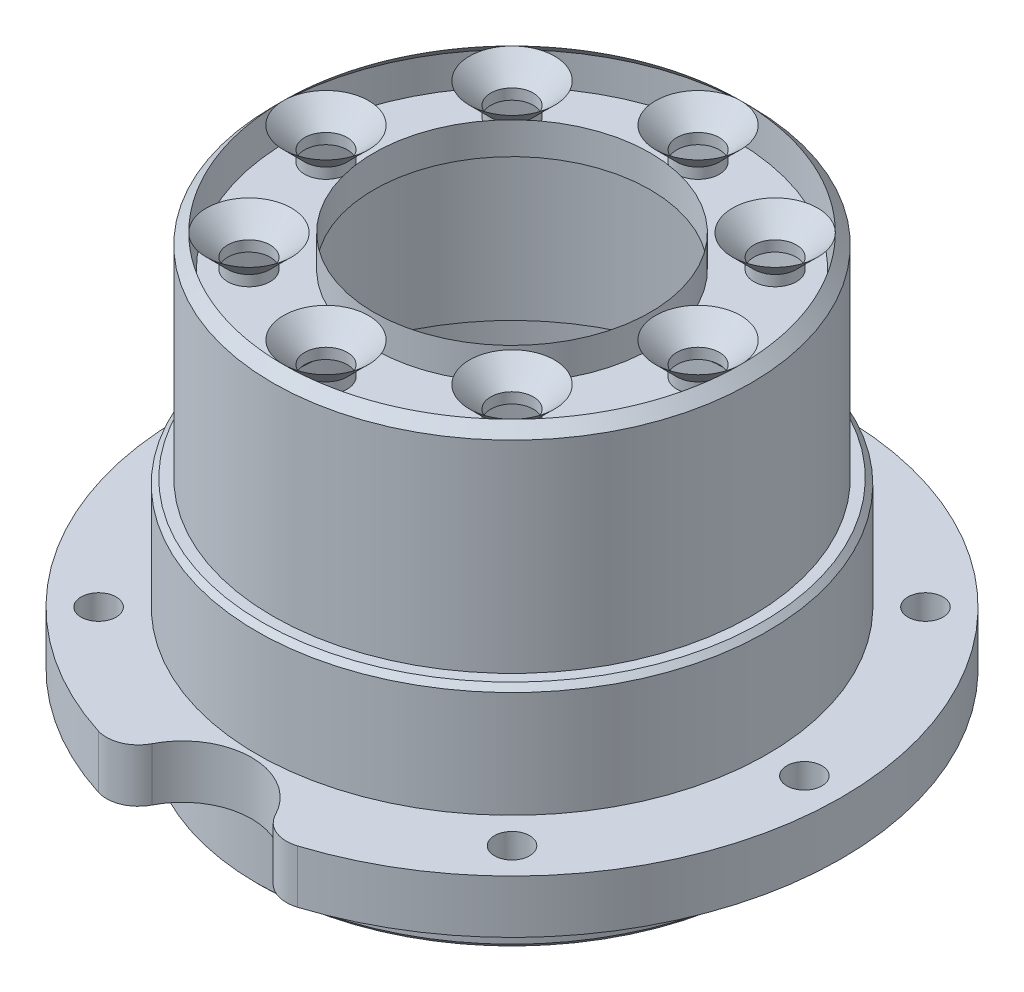
ISO-10303-21;
HEADER;
FILE_DESCRIPTION(('STEP AP214'),'2;1');
FILE_NAME('part.step','',(''),(''),'','','');
FILE_SCHEMA(('AUTOMOTIVE_DESIGN { 1 0 10303 214 1 1 1 1 }'));
ENDSEC;
DATA;
#1=APPLICATION_CONTEXT('core data for automotive mechanical design processes');
#2=APPLICATION_PROTOCOL_DEFINITION('international standard','automotive_design',2000,#1);
#3=PRODUCT_CONTEXT('',#1,'mechanical');
#4=PRODUCT('Part','Part','',(#3));
#5=PRODUCT_RELATED_PRODUCT_CATEGORY('part','',(#4));
#6=PRODUCT_DEFINITION_FORMATION('','',#4);
#7=PRODUCT_DEFINITION_CONTEXT('part definition',#1,'design');
#8=PRODUCT_DEFINITION('design','',#6,#7);
#9=PRODUCT_DEFINITION_SHAPE('','',#8);
#10=(LENGTH_UNIT() NAMED_UNIT(*) SI_UNIT(.MILLI.,.METRE.));
#11=(NAMED_UNIT(*) PLANE_ANGLE_UNIT() SI_UNIT($,.RADIAN.));
#12=(NAMED_UNIT(*) SI_UNIT($,.STERADIAN.) SOLID_ANGLE_UNIT());
#13=UNCERTAINTY_MEASURE_WITH_UNIT(LENGTH_MEASURE(1.E-05),#10,'distance_accuracy_value','');
#14=(GEOMETRIC_REPRESENTATION_CONTEXT(3) GLOBAL_UNCERTAINTY_ASSIGNED_CONTEXT((#13)) GLOBAL_UNIT_ASSIGNED_CONTEXT((#10,
#11,#12)) REPRESENTATION_CONTEXT('',''));
#15=CARTESIAN_POINT('',(0.,0.,0.));
#16=DIRECTION('',(0.,0.,1.));
#17=DIRECTION('',(1.,0.,0.));
#18=AXIS2_PLACEMENT_3D('',#15,#16,#17);
#19=CARTESIAN_POINT('',(0.,0.,0.));
#20=DIRECTION('',(0.,-1.,0.));
#21=DIRECTION('',(0.,0.,-1.));
#22=AXIS2_PLACEMENT_3D('',#19,#20,#21);
#23=CYLINDRICAL_SURFACE('',#22,13.);
#24=CARTESIAN_POINT('',(0.,35.5,0.));
#25=DIRECTION('',(0.,-1.,0.));
#26=DIRECTION('',(0.,0.,-1.));
#27=AXIS2_PLACEMENT_3D('',#24,#25,#26);
#28=CIRCLE('',#27,13.);
#29=CARTESIAN_POINT('',(0.,35.5,-13.));
#30=VERTEX_POINT('',#29);
#31=EDGE_CURVE('E243',#30,#30,#28,.T.);
#32=ORIENTED_EDGE('',*,*,#31,.F.);
#33=EDGE_LOOP('',(#32));
#34=FACE_BOUND('',#33,.T.);
#35=CARTESIAN_POINT('',(0.,32.5,0.));
#36=DIRECTION('',(0.,-1.,0.));
#37=DIRECTION('',(0.,0.,-1.));
#38=AXIS2_PLACEMENT_3D('',#35,#36,#37);
#39=CIRCLE('',#38,13.);
#40=CARTESIAN_POINT('',(0.,32.5,-13.));
#41=VERTEX_POINT('',#40);
#42=EDGE_CURVE('E213',#41,#41,#39,.T.);
#43=ORIENTED_EDGE('',*,*,#42,.T.);
#44=EDGE_LOOP('',(#43));
#45=FACE_BOUND('',#44,.T.);
#46=ADVANCED_FACE('F41',(#34,#45),#23,.F.);
#47=CARTESIAN_POINT('',(-22.5,35.5,0.));
#48=DIRECTION('',(0.,-1.,0.));
#49=DIRECTION('',(0.,0.,-1.));
#50=AXIS2_PLACEMENT_3D('',#47,#48,#49);
#51=PLANE('',#50);
#52=CARTESIAN_POINT('',(0.,35.5,-17.5));
#53=DIRECTION('',(0.,1.,0.));
#54=DIRECTION('',(0.,0.,1.));
#55=AXIS2_PLACEMENT_3D('',#52,#53,#54);
#56=CIRCLE('',#55,4.);
#57=CARTESIAN_POINT('',(0.,35.5,-21.5));
#58=VERTEX_POINT('',#57);
#59=EDGE_CURVE('E111',#58,#58,#56,.T.);
#60=ORIENTED_EDGE('',*,*,#59,.F.);
#61=CARTESIAN_POINT('',(0.,35.5,0.));
#62=DIRECTION('',(0.,-1.,0.));
#63=DIRECTION('',(0.,0.,-1.));
#64=AXIS2_PLACEMENT_3D('',#61,#62,#63);
#65=CIRCLE('',#64,21.5);
#66=CARTESIAN_POINT('',(-15.2027957955108,35.5,-15.2027957955108));
#67=VERTEX_POINT('',#66);
#68=EDGE_CURVE('E293',#58,#67,#65,.F.);
#69=ORIENTED_EDGE('',*,*,#68,.T.);
#70=CARTESIAN_POINT('',(-12.3743686707646,35.5,-12.3743686707646));
#71=DIRECTION('',(0.,1.,0.));
#72=DIRECTION('',(0.,0.,1.));
#73=AXIS2_PLACEMENT_3D('',#70,#71,#72);
#74=CIRCLE('',#73,4.);
#75=EDGE_CURVE('E170',#67,#67,#74,.T.);
#76=ORIENTED_EDGE('',*,*,#75,.F.);
#77=CARTESIAN_POINT('',(0.,35.5,0.));
#78=DIRECTION('',(0.,-1.,0.));
#79=DIRECTION('',(0.,0.,-1.));
#80=AXIS2_PLACEMENT_3D('',#77,#78,#79);
#81=CIRCLE('',#80,21.5);
#82=CARTESIAN_POINT('',(-21.5,35.5,0.));
#83=VERTEX_POINT('',#82);
#84=EDGE_CURVE('E291',#67,#83,#81,.F.);
#85=ORIENTED_EDGE('',*,*,#84,.T.);
#86=CARTESIAN_POINT('',(-17.5,35.5,0.));
#87=DIRECTION('',(0.,1.,0.));
#88=DIRECTION('',(0.,0.,1.));
#89=AXIS2_PLACEMENT_3D('',#86,#87,#88);
#90=CIRCLE('',#89,4.);
#91=EDGE_CURVE('E163',#83,#83,#90,.T.);
#92=ORIENTED_EDGE('',*,*,#91,.F.);
#93=CARTESIAN_POINT('',(0.,35.5,0.));
#94=DIRECTION('',(0.,-1.,0.));
#95=DIRECTION('',(0.,0.,-1.));
#96=AXIS2_PLACEMENT_3D('',#93,#94,#95);
#97=CIRCLE('',#96,21.5);
#98=CARTESIAN_POINT('',(-15.2027957955108,35.5,15.2027957955108));
#99=VERTEX_POINT('',#98);
#100=EDGE_CURVE('E289',#83,#99,#97,.F.);
#101=ORIENTED_EDGE('',*,*,#100,.T.);
#102=CARTESIAN_POINT('',(-12.3743686707646,35.5,12.3743686707646));
#103=DIRECTION('',(0.,1.,0.));
#104=DIRECTION('',(0.,0.,1.));
#105=AXIS2_PLACEMENT_3D('',#102,#103,#104);
#106=CIRCLE('',#105,4.);
#107=EDGE_CURVE('E156',#99,#99,#106,.T.);
#108=ORIENTED_EDGE('',*,*,#107,.F.);
#109=CARTESIAN_POINT('',(0.,35.5,0.));
#110=DIRECTION('',(0.,-1.,0.));
#111=DIRECTION('',(0.,0.,-1.));
#112=AXIS2_PLACEMENT_3D('',#109,#110,#111);
#113=CIRCLE('',#112,21.5);
#114=CARTESIAN_POINT('',(0.,35.5,21.5));
#115=VERTEX_POINT('',#114);
#116=EDGE_CURVE('E287',#99,#115,#113,.F.);
#117=ORIENTED_EDGE('',*,*,#116,.T.);
#118=CARTESIAN_POINT('',(0.,35.5,17.5));
#119=DIRECTION('',(0.,1.,0.));
#120=DIRECTION('',(0.,0.,1.));
#121=AXIS2_PLACEMENT_3D('',#118,#119,#120);
#122=CIRCLE('',#121,4.);
#123=EDGE_CURVE('E149',#115,#115,#122,.T.);
#124=ORIENTED_EDGE('',*,*,#123,.F.);
#125=CARTESIAN_POINT('',(0.,35.5,0.));
#126=DIRECTION('',(0.,-1.,0.));
#127=DIRECTION('',(0.,0.,-1.));
#128=AXIS2_PLACEMENT_3D('',#125,#126,#127);
#129=CIRCLE('',#128,21.5);
#130=CARTESIAN_POINT('',(15.2027957955108,35.5,15.2027957955108));
#131=VERTEX_POINT('',#130);
#132=EDGE_CURVE('E285',#115,#131,#129,.F.);
#133=ORIENTED_EDGE('',*,*,#132,.T.);
#134=CARTESIAN_POINT('',(12.3743686707646,35.5,12.3743686707646));
#135=DIRECTION('',(0.,1.,0.));
#136=DIRECTION('',(0.,0.,1.));
#137=AXIS2_PLACEMENT_3D('',#134,#135,#136);
#138=CIRCLE('',#137,4.);
#139=EDGE_CURVE('E142',#131,#131,#138,.T.);
#140=ORIENTED_EDGE('',*,*,#139,.F.);
#141=CARTESIAN_POINT('',(0.,35.5,0.));
#142=DIRECTION('',(0.,-1.,0.));
#143=DIRECTION('',(0.,0.,-1.));
#144=AXIS2_PLACEMENT_3D('',#141,#142,#143);
#145=CIRCLE('',#144,21.5);
#146=CARTESIAN_POINT('',(21.5,35.5,0.));
#147=VERTEX_POINT('',#146);
#148=EDGE_CURVE('E283',#131,#147,#145,.F.);
#149=ORIENTED_EDGE('',*,*,#148,.T.);
#150=CARTESIAN_POINT('',(17.5,35.5,0.));
#151=DIRECTION('',(0.,1.,0.));
#152=DIRECTION('',(0.,0.,1.));
#153=AXIS2_PLACEMENT_3D('',#150,#151,#152);
#154=CIRCLE('',#153,4.);
#155=EDGE_CURVE('E135',#147,#147,#154,.T.);
#156=ORIENTED_EDGE('',*,*,#155,.F.);
#157=CARTESIAN_POINT('',(0.,35.5,0.));
#158=DIRECTION('',(0.,-1.,0.));
#159=DIRECTION('',(0.,0.,-1.));
#160=AXIS2_PLACEMENT_3D('',#157,#158,#159);
#161=CIRCLE('',#160,21.5);
#162=CARTESIAN_POINT('',(15.2027957955108,35.5,-15.2027957955108));
#163=VERTEX_POINT('',#162);
#164=EDGE_CURVE('E117',#147,#163,#161,.F.);
#165=ORIENTED_EDGE('',*,*,#164,.T.);
#166=CARTESIAN_POINT('',(12.3743686707646,35.5,-12.3743686707646));
#167=DIRECTION('',(0.,1.,0.));
#168=DIRECTION('',(0.,0.,1.));
#169=AXIS2_PLACEMENT_3D('',#166,#167,#168);
#170=CIRCLE('',#169,4.);
#171=EDGE_CURVE('E114',#163,#163,#170,.T.);
#172=ORIENTED_EDGE('',*,*,#171,.F.);
#173=CARTESIAN_POINT('',(0.,35.5,0.));
#174=DIRECTION('',(0.,-1.,0.));
#175=DIRECTION('',(0.,0.,-1.));
#176=AXIS2_PLACEMENT_3D('',#173,#174,#175);
#177=CIRCLE('',#176,21.5);
#178=EDGE_CURVE('E106',#163,#58,#177,.F.);
#179=ORIENTED_EDGE('',*,*,#178,.T.);
#180=EDGE_LOOP('',(#60,#69,#76,#85,#92,#101,#108,#117,#124,#133,#140,#149,#156,#165,#172,#179));
#181=FACE_BOUND('',#180,.T.);
#182=ORIENTED_EDGE('',*,*,#31,.T.);
#183=EDGE_LOOP('',(#182));
#184=FACE_BOUND('',#183,.T.);
#185=ADVANCED_FACE('F108',(#181,#184),#51,.F.);
#186=CARTESIAN_POINT('',(0.,0.,0.));
#187=DIRECTION('',(0.,-1.,0.));
#188=DIRECTION('',(0.,0.,-1.));
#189=AXIS2_PLACEMENT_3D('',#186,#187,#188);
#190=CYLINDRICAL_SURFACE('',#189,22.5);
#191=CARTESIAN_POINT('',(0.,34.5,0.));
#192=DIRECTION('',(0.,-1.,0.));
#193=DIRECTION('',(0.,0.,-1.));
#194=AXIS2_PLACEMENT_3D('',#191,#192,#193);
#195=CIRCLE('',#194,22.5);
#196=CARTESIAN_POINT('',(0.,34.5,-22.5));
#197=VERTEX_POINT('',#196);
#198=EDGE_CURVE('E118',#197,#197,#195,.T.);
#199=ORIENTED_EDGE('',*,*,#198,.T.);
#200=EDGE_LOOP('',(#199));
#201=FACE_BOUND('',#200,.T.);
#202=CARTESIAN_POINT('',(0.,15.5,0.));
#203=DIRECTION('',(0.,-1.,0.));
#204=DIRECTION('',(0.,0.,-1.));
#205=AXIS2_PLACEMENT_3D('',#202,#203,#204);
#206=CIRCLE('',#205,22.5);
#207=CARTESIAN_POINT('',(0.,15.5,-22.5));
#208=VERTEX_POINT('',#207);
#209=EDGE_CURVE('E240',#208,#208,#206,.T.);
#210=ORIENTED_EDGE('',*,*,#209,.F.);
#211=EDGE_LOOP('',(#210));
#212=FACE_BOUND('',#211,.T.);
#213=ADVANCED_FACE('F340',(#201,#212),#190,.T.);
#214=CARTESIAN_POINT('',(-24.,15.5,0.));
#215=DIRECTION('',(0.,-1.,0.));
#216=DIRECTION('',(0.,0.,-1.));
#217=AXIS2_PLACEMENT_3D('',#214,#215,#216);
#218=PLANE('',#217);
#219=CARTESIAN_POINT('',(0.,15.5,0.));
#220=DIRECTION('',(0.,-1.,0.));
#221=DIRECTION('',(0.,0.,-1.));
#222=AXIS2_PLACEMENT_3D('',#219,#220,#221);
#223=CIRCLE('',#222,23.5);
#224=CARTESIAN_POINT('',(0.,15.5,-23.5));
#225=VERTEX_POINT('',#224);
#226=EDGE_CURVE('E277',#225,#225,#223,.F.);
#227=ORIENTED_EDGE('',*,*,#226,.T.);
#228=EDGE_LOOP('',(#227));
#229=FACE_BOUND('',#228,.T.);
#230=ORIENTED_EDGE('',*,*,#209,.T.);
#231=EDGE_LOOP('',(#230));
#232=FACE_BOUND('',#231,.T.);
#233=ADVANCED_FACE('F371',(#229,#232),#218,.F.);
#234=CARTESIAN_POINT('',(0.,0.,0.));
#235=DIRECTION('',(0.,-1.,0.));
#236=DIRECTION('',(0.,0.,-1.));
#237=AXIS2_PLACEMENT_3D('',#234,#235,#236);
#238=CYLINDRICAL_SURFACE('',#237,24.);
#239=CARTESIAN_POINT('',(0.,15.,0.));
#240=DIRECTION('',(0.,-1.,0.));
#241=DIRECTION('',(0.,0.,-1.));
#242=AXIS2_PLACEMENT_3D('',#239,#240,#241);
#243=CIRCLE('',#242,24.);
#244=CARTESIAN_POINT('',(0.,15.,-24.));
#245=VERTEX_POINT('',#244);
#246=EDGE_CURVE('E274',#245,#245,#243,.T.);
#247=ORIENTED_EDGE('',*,*,#246,.T.);
#248=EDGE_LOOP('',(#247));
#249=FACE_BOUND('',#248,.T.);
#250=CARTESIAN_POINT('',(0.,5.,0.));
#251=DIRECTION('',(0.,-1.,0.));
#252=DIRECTION('',(0.,0.,-1.));
#253=AXIS2_PLACEMENT_3D('',#250,#251,#252);
#254=CIRCLE('',#253,24.);
#255=CARTESIAN_POINT('',(0.,5.,-24.));
#256=VERTEX_POINT('',#255);
#257=EDGE_CURVE('E237',#256,#256,#254,.T.);
#258=ORIENTED_EDGE('',*,*,#257,.F.);
#259=EDGE_LOOP('',(#258));
#260=FACE_BOUND('',#259,.T.);
#261=ADVANCED_FACE('F375',(#249,#260),#238,.T.);
#262=CARTESIAN_POINT('',(-31.,5.,0.));
#263=DIRECTION('',(0.,-1.,0.));
#264=DIRECTION('',(0.,0.,-1.));
#265=AXIS2_PLACEMENT_3D('',#262,#263,#264);
#266=PLANE('',#265);
#267=CARTESIAN_POINT('',(-19.4454364826301,5.,-19.4454364826301));
#268=DIRECTION('',(0.,1.,0.));
#269=DIRECTION('',(0.,0.,1.));
#270=AXIS2_PLACEMENT_3D('',#267,#268,#269);
#271=CIRCLE('',#270,1.64999999999999);
#272=CARTESIAN_POINT('',(-19.4454364826301,5.,-17.7954364826301));
#273=VERTEX_POINT('',#272);
#274=EDGE_CURVE('E177',#273,#273,#271,.T.);
#275=ORIENTED_EDGE('',*,*,#274,.F.);
#276=EDGE_LOOP('',(#275));
#277=FACE_BOUND('',#276,.T.);
#278=CARTESIAN_POINT('',(0.,5.,-27.5));
#279=DIRECTION('',(0.,1.,0.));
#280=DIRECTION('',(0.,0.,1.));
#281=AXIS2_PLACEMENT_3D('',#278,#279,#280);
#282=CIRCLE('',#281,1.64999999999999);
#283=CARTESIAN_POINT('',(0.,5.,-25.85));
#284=VERTEX_POINT('',#283);
#285=EDGE_CURVE('E181',#284,#284,#282,.T.);
#286=ORIENTED_EDGE('',*,*,#285,.F.);
#287=EDGE_LOOP('',(#286));
#288=FACE_BOUND('',#287,.T.);
#289=CARTESIAN_POINT('',(19.4454364826301,5.,-19.4454364826301));
#290=DIRECTION('',(0.,1.,0.));
#291=DIRECTION('',(0.,0.,1.));
#292=AXIS2_PLACEMENT_3D('',#289,#290,#291);
#293=CIRCLE('',#292,1.64999999999999);
#294=CARTESIAN_POINT('',(19.4454364826301,5.,-17.7954364826301));
#295=VERTEX_POINT('',#294);
#296=EDGE_CURVE('E187',#295,#295,#293,.T.);
#297=ORIENTED_EDGE('',*,*,#296,.F.);
#298=EDGE_LOOP('',(#297));
#299=FACE_BOUND('',#298,.T.);
#300=CARTESIAN_POINT('',(27.5,5.,0.));
#301=DIRECTION('',(0.,1.,0.));
#302=DIRECTION('',(0.,0.,1.));
#303=AXIS2_PLACEMENT_3D('',#300,#301,#302);
#304=CIRCLE('',#303,1.64999999999999);
#305=CARTESIAN_POINT('',(27.5,5.,1.64999999999999));
#306=VERTEX_POINT('',#305);
#307=EDGE_CURVE('E191',#306,#306,#304,.T.);
#308=ORIENTED_EDGE('',*,*,#307,.F.);
#309=EDGE_LOOP('',(#308));
#310=FACE_BOUND('',#309,.T.);
#311=CARTESIAN_POINT('',(19.4454364826301,5.,19.4454364826301));
#312=DIRECTION('',(0.,1.,0.));
#313=DIRECTION('',(0.,0.,1.));
#314=AXIS2_PLACEMENT_3D('',#311,#312,#313);
#315=CIRCLE('',#314,1.64999999999999);
#316=CARTESIAN_POINT('',(19.4454364826301,5.,21.09543648263));
#317=VERTEX_POINT('',#316);
#318=EDGE_CURVE('E197',#317,#317,#315,.T.);
#319=ORIENTED_EDGE('',*,*,#318,.F.);
#320=EDGE_LOOP('',(#319));
#321=FACE_BOUND('',#320,.T.);
#322=CARTESIAN_POINT('',(-19.4454364826301,5.,19.4454364826301));
#323=DIRECTION('',(0.,1.,0.));
#324=DIRECTION('',(0.,0.,1.));
#325=AXIS2_PLACEMENT_3D('',#322,#323,#324);
#326=CIRCLE('',#325,1.64999999999999);
#327=CARTESIAN_POINT('',(-19.4454364826301,5.,21.09543648263));
#328=VERTEX_POINT('',#327);
#329=EDGE_CURVE('E203',#328,#328,#326,.T.);
#330=ORIENTED_EDGE('',*,*,#329,.F.);
#331=EDGE_LOOP('',(#330));
#332=FACE_BOUND('',#331,.T.);
#333=CARTESIAN_POINT('',(-27.5,5.,0.));
#334=DIRECTION('',(0.,1.,0.));
#335=DIRECTION('',(0.,0.,1.));
#336=AXIS2_PLACEMENT_3D('',#333,#334,#335);
#337=CIRCLE('',#336,1.64999999999999);
#338=CARTESIAN_POINT('',(-27.5,5.,1.64999999999999));
#339=VERTEX_POINT('',#338);
#340=EDGE_CURVE('E207',#339,#339,#337,.T.);
#341=ORIENTED_EDGE('',*,*,#340,.F.);
#342=EDGE_LOOP('',(#341));
#343=FACE_BOUND('',#342,.T.);
#344=CARTESIAN_POINT('',(0.,5.,31.));
#345=DIRECTION('',(0.,1.,0.));
#346=DIRECTION('',(0.,0.,1.));
#347=AXIS2_PLACEMENT_3D('',#344,#345,#346);
#348=CIRCLE('',#347,6.5);
#349=CARTESIAN_POINT('',(5.79238782325286,5.,28.0507215619694));
#350=VERTEX_POINT('',#349);
#351=CARTESIAN_POINT('',(-5.79238782325285,5.,28.0507215619694));
#352=VERTEX_POINT('',#351);
#353=EDGE_CURVE('E123',#350,#352,#348,.T.);
#354=ORIENTED_EDGE('',*,*,#353,.F.);
#355=CARTESIAN_POINT('',(8.4657975878311,5.,26.6895161290323));
#356=DIRECTION('',(0.,-1.,0.));
#357=DIRECTION('',(0.,0.,-1.));
#358=AXIS2_PLACEMENT_3D('',#355,#356,#357);
#359=CIRCLE('',#358,3.);
#360=CARTESIAN_POINT('',(9.37284732938443,5.,29.5491071428571));
#361=VERTEX_POINT('',#360);
#362=EDGE_CURVE('E11',#350,#361,#359,.F.);
#363=ORIENTED_EDGE('',*,*,#362,.T.);
#364=CARTESIAN_POINT('',(0.,5.,0.));
#365=DIRECTION('',(0.,-1.,0.));
#366=DIRECTION('',(0.,0.,-1.));
#367=AXIS2_PLACEMENT_3D('',#364,#365,#366);
#368=CIRCLE('',#367,31.);
#369=CARTESIAN_POINT('',(-9.37284732938443,5.,29.5491071428571));
#370=VERTEX_POINT('',#369);
#371=EDGE_CURVE('E234',#370,#361,#368,.T.);
#372=ORIENTED_EDGE('',*,*,#371,.F.);
#373=CARTESIAN_POINT('',(-8.4657975878311,5.,26.6895161290323));
#374=DIRECTION('',(0.,-1.,0.));
#375=DIRECTION('',(0.,0.,-1.));
#376=AXIS2_PLACEMENT_3D('',#373,#374,#375);
#377=CIRCLE('',#376,3.);
#378=EDGE_CURVE('E49',#370,#352,#377,.F.);
#379=ORIENTED_EDGE('',*,*,#378,.T.);
#380=EDGE_LOOP('',(#354,#363,#372,#379));
#381=FACE_BOUND('',#380,.T.);
#382=ORIENTED_EDGE('',*,*,#257,.T.);
#383=EDGE_LOOP('',(#382));
#384=FACE_BOUND('',#383,.T.);
#385=ADVANCED_FACE('F321',(#277,#288,#299,#310,#321,#332,#343,#381,#384),#266,.F.);
#386=CARTESIAN_POINT('',(0.,0.,0.));
#387=DIRECTION('',(0.,-1.,0.));
#388=DIRECTION('',(0.,0.,-1.));
#389=AXIS2_PLACEMENT_3D('',#386,#387,#388);
#390=CYLINDRICAL_SURFACE('',#389,31.);
#391=ORIENTED_EDGE('',*,*,#371,.T.);
#392=DIRECTION('',(0.,-1.,0.));
#393=VECTOR('',#392,1.);
#394=CARTESIAN_POINT('',(9.37284732938443,0.,29.5491071428571));
#395=LINE('',#394,#393);
#396=CARTESIAN_POINT('',(9.37284732938443,0.,29.5491071428571));
#397=VERTEX_POINT('',#396);
#398=EDGE_CURVE('E301',#361,#397,#395,.T.);
#399=ORIENTED_EDGE('',*,*,#398,.T.);
#400=CARTESIAN_POINT('',(0.,0.,0.));
#401=DIRECTION('',(0.,-1.,0.));
#402=DIRECTION('',(0.,0.,-1.));
#403=AXIS2_PLACEMENT_3D('',#400,#401,#402);
#404=CIRCLE('',#403,31.);
#405=CARTESIAN_POINT('',(-9.37284732938443,0.,29.5491071428571));
#406=VERTEX_POINT('',#405);
#407=EDGE_CURVE('E231',#406,#397,#404,.T.);
#408=ORIENTED_EDGE('',*,*,#407,.F.);
#409=DIRECTION('',(0.,-1.,0.));
#410=VECTOR('',#409,1.);
#411=CARTESIAN_POINT('',(-9.37284732938443,0.,29.5491071428571));
#412=LINE('',#411,#410);
#413=EDGE_CURVE('E298',#406,#370,#412,.F.);
#414=ORIENTED_EDGE('',*,*,#413,.T.);
#415=EDGE_LOOP('',(#391,#399,#408,#414));
#416=FACE_BOUND('',#415,.T.);
#417=ADVANCED_FACE('F319',(#416),#390,.T.);
#418=CARTESIAN_POINT('',(-31.,0.,0.));
#419=DIRECTION('',(0.,1.,0.));
#420=DIRECTION('',(0.,0.,1.));
#421=AXIS2_PLACEMENT_3D('',#418,#419,#420);
#422=PLANE('',#421);
#423=CARTESIAN_POINT('',(-19.4454364826301,0.,-19.4454364826301));
#424=DIRECTION('',(0.,1.,0.));
#425=DIRECTION('',(0.,0.,1.));
#426=AXIS2_PLACEMENT_3D('',#423,#424,#425);
#427=CIRCLE('',#426,1.64999999999999);
#428=CARTESIAN_POINT('',(-19.4454364826301,0.,-17.7954364826301));
#429=VERTEX_POINT('',#428);
#430=EDGE_CURVE('E180',#429,#429,#427,.T.);
#431=ORIENTED_EDGE('',*,*,#430,.T.);
#432=EDGE_LOOP('',(#431));
#433=FACE_BOUND('',#432,.T.);
#434=CARTESIAN_POINT('',(0.,0.,-27.5));
#435=DIRECTION('',(0.,1.,0.));
#436=DIRECTION('',(0.,0.,1.));
#437=AXIS2_PLACEMENT_3D('',#434,#435,#436);
#438=CIRCLE('',#437,1.64999999999999);
#439=CARTESIAN_POINT('',(0.,0.,-25.85));
#440=VERTEX_POINT('',#439);
#441=EDGE_CURVE('E184',#440,#440,#438,.T.);
#442=ORIENTED_EDGE('',*,*,#441,.T.);
#443=EDGE_LOOP('',(#442));
#444=FACE_BOUND('',#443,.T.);
#445=CARTESIAN_POINT('',(19.4454364826301,0.,-19.4454364826301));
#446=DIRECTION('',(0.,1.,0.));
#447=DIRECTION('',(0.,0.,1.));
#448=AXIS2_PLACEMENT_3D('',#445,#446,#447);
#449=CIRCLE('',#448,1.64999999999999);
#450=CARTESIAN_POINT('',(19.4454364826301,0.,-17.7954364826301));
#451=VERTEX_POINT('',#450);
#452=EDGE_CURVE('E190',#451,#451,#449,.T.);
#453=ORIENTED_EDGE('',*,*,#452,.T.);
#454=EDGE_LOOP('',(#453));
#455=FACE_BOUND('',#454,.T.);
#456=CARTESIAN_POINT('',(27.5,0.,0.));
#457=DIRECTION('',(0.,1.,0.));
#458=DIRECTION('',(0.,0.,1.));
#459=AXIS2_PLACEMENT_3D('',#456,#457,#458);
#460=CIRCLE('',#459,1.64999999999999);
#461=CARTESIAN_POINT('',(27.5,0.,1.64999999999999));
#462=VERTEX_POINT('',#461);
#463=EDGE_CURVE('E194',#462,#462,#460,.T.);
#464=ORIENTED_EDGE('',*,*,#463,.T.);
#465=EDGE_LOOP('',(#464));
#466=FACE_BOUND('',#465,.T.);
#467=CARTESIAN_POINT('',(19.4454364826301,0.,19.4454364826301));
#468=DIRECTION('',(0.,1.,0.));
#469=DIRECTION('',(0.,0.,1.));
#470=AXIS2_PLACEMENT_3D('',#467,#468,#469);
#471=CIRCLE('',#470,1.64999999999999);
#472=CARTESIAN_POINT('',(19.4454364826301,0.,21.09543648263));
#473=VERTEX_POINT('',#472);
#474=EDGE_CURVE('E200',#473,#473,#471,.T.);
#475=ORIENTED_EDGE('',*,*,#474,.T.);
#476=EDGE_LOOP('',(#475));
#477=FACE_BOUND('',#476,.T.);
#478=CARTESIAN_POINT('',(-19.4454364826301,0.,19.4454364826301));
#479=DIRECTION('',(0.,1.,0.));
#480=DIRECTION('',(0.,0.,1.));
#481=AXIS2_PLACEMENT_3D('',#478,#479,#480);
#482=CIRCLE('',#481,1.64999999999999);
#483=CARTESIAN_POINT('',(-19.4454364826301,0.,21.0954364826301));
#484=VERTEX_POINT('',#483);
#485=EDGE_CURVE('E206',#484,#484,#482,.T.);
#486=ORIENTED_EDGE('',*,*,#485,.T.);
#487=EDGE_LOOP('',(#486));
#488=FACE_BOUND('',#487,.T.);
#489=CARTESIAN_POINT('',(-27.5,0.,0.));
#490=DIRECTION('',(0.,1.,0.));
#491=DIRECTION('',(0.,0.,1.));
#492=AXIS2_PLACEMENT_3D('',#489,#490,#491);
#493=CIRCLE('',#492,1.64999999999999);
#494=CARTESIAN_POINT('',(-27.5,0.,1.64999999999999));
#495=VERTEX_POINT('',#494);
#496=EDGE_CURVE('E210',#495,#495,#493,.T.);
#497=ORIENTED_EDGE('',*,*,#496,.T.);
#498=EDGE_LOOP('',(#497));
#499=FACE_BOUND('',#498,.T.);
#500=CARTESIAN_POINT('',(0.,0.,0.));
#501=DIRECTION('',(0.,-1.,0.));
#502=DIRECTION('',(0.,0.,-1.));
#503=AXIS2_PLACEMENT_3D('',#500,#501,#502);
#504=CIRCLE('',#503,24.);
#505=CARTESIAN_POINT('',(0.,0.,-24.));
#506=VERTEX_POINT('',#505);
#507=EDGE_CURVE('E228',#506,#506,#504,.T.);
#508=ORIENTED_EDGE('',*,*,#507,.F.);
#509=EDGE_LOOP('',(#508));
#510=FACE_BOUND('',#509,.T.);
#511=ORIENTED_EDGE('',*,*,#407,.T.);
#512=CARTESIAN_POINT('',(8.4657975878311,0.,26.6895161290323));
#513=DIRECTION('',(0.,1.,0.));
#514=DIRECTION('',(0.,0.,1.));
#515=AXIS2_PLACEMENT_3D('',#512,#513,#514);
#516=CIRCLE('',#515,3.);
#517=CARTESIAN_POINT('',(5.79238782325286,0.,28.0507215619694));
#518=VERTEX_POINT('',#517);
#519=EDGE_CURVE('E306',#397,#518,#516,.F.);
#520=ORIENTED_EDGE('',*,*,#519,.T.);
#521=CARTESIAN_POINT('',(0.,0.,31.));
#522=DIRECTION('',(0.,1.,0.));
#523=DIRECTION('',(0.,0.,1.));
#524=AXIS2_PLACEMENT_3D('',#521,#522,#523);
#525=CIRCLE('',#524,6.5);
#526=CARTESIAN_POINT('',(-5.79238782325285,0.,28.0507215619694));
#527=VERTEX_POINT('',#526);
#528=EDGE_CURVE('E295',#518,#527,#525,.T.);
#529=ORIENTED_EDGE('',*,*,#528,.T.);
#530=CARTESIAN_POINT('',(-8.4657975878311,0.,26.6895161290323));
#531=DIRECTION('',(0.,1.,0.));
#532=DIRECTION('',(0.,0.,1.));
#533=AXIS2_PLACEMENT_3D('',#530,#531,#532);
#534=CIRCLE('',#533,3.);
#535=EDGE_CURVE('E304',#527,#406,#534,.F.);
#536=ORIENTED_EDGE('',*,*,#535,.T.);
#537=EDGE_LOOP('',(#511,#520,#529,#536));
#538=FACE_BOUND('',#537,.T.);
#539=ADVANCED_FACE('F315',(#433,#444,#455,#466,#477,#488,#499,#510,#538),#422,.F.);
#540=CARTESIAN_POINT('',(0.,0.,0.));
#541=DIRECTION('',(0.,-1.,0.));
#542=DIRECTION('',(0.,0.,-1.));
#543=AXIS2_PLACEMENT_3D('',#540,#541,#542);
#544=CYLINDRICAL_SURFACE('',#543,24.);
#545=CARTESIAN_POINT('',(0.,-5.49999999999997,0.));
#546=DIRECTION('',(0.,1.,0.));
#547=DIRECTION('',(0.,0.,1.));
#548=AXIS2_PLACEMENT_3D('',#545,#546,#547);
#549=CIRCLE('',#548,24.);
#550=CARTESIAN_POINT('',(0.,-5.49999999999997,24.));
#551=VERTEX_POINT('',#550);
#552=EDGE_CURVE('E271',#551,#551,#549,.T.);
#553=ORIENTED_EDGE('',*,*,#552,.T.);
#554=EDGE_LOOP('',(#553));
#555=FACE_BOUND('',#554,.T.);
#556=ORIENTED_EDGE('',*,*,#507,.T.);
#557=EDGE_LOOP('',(#556));
#558=FACE_BOUND('',#557,.T.);
#559=ADVANCED_FACE('F391',(#555,#558),#544,.T.);
#560=CARTESIAN_POINT('',(-24.,-6.,0.));
#561=DIRECTION('',(0.,1.,0.));
#562=DIRECTION('',(0.,0.,1.));
#563=AXIS2_PLACEMENT_3D('',#560,#561,#562);
#564=PLANE('',#563);
#565=CARTESIAN_POINT('',(0.,-6.,0.));
#566=DIRECTION('',(0.,1.,0.));
#567=DIRECTION('',(0.,0.,1.));
#568=AXIS2_PLACEMENT_3D('',#565,#566,#567);
#569=CIRCLE('',#568,23.5);
#570=CARTESIAN_POINT('',(0.,-6.,23.5));
#571=VERTEX_POINT('',#570);
#572=EDGE_CURVE('E246',#571,#571,#569,.F.);
#573=ORIENTED_EDGE('',*,*,#572,.T.);
#574=EDGE_LOOP('',(#573));
#575=FACE_BOUND('',#574,.T.);
#576=CARTESIAN_POINT('',(0.,-6.,0.));
#577=DIRECTION('',(0.,-1.,0.));
#578=DIRECTION('',(0.,0.,-1.));
#579=AXIS2_PLACEMENT_3D('',#576,#577,#578);
#580=CIRCLE('',#579,22.);
#581=CARTESIAN_POINT('',(0.,-6.,-22.));
#582=VERTEX_POINT('',#581);
#583=EDGE_CURVE('E225',#582,#582,#580,.T.);
#584=ORIENTED_EDGE('',*,*,#583,.F.);
#585=EDGE_LOOP('',(#584));
#586=FACE_BOUND('',#585,.T.);
#587=ADVANCED_FACE('F395',(#575,#586),#564,.F.);
#588=CARTESIAN_POINT('',(0.,0.,0.));
#589=DIRECTION('',(0.,-1.,0.));
#590=DIRECTION('',(0.,0.,-1.));
#591=AXIS2_PLACEMENT_3D('',#588,#589,#590);
#592=CYLINDRICAL_SURFACE('',#591,22.);
#593=CARTESIAN_POINT('',(0.,13.5,0.));
#594=DIRECTION('',(0.,-1.,0.));
#595=DIRECTION('',(0.,0.,-1.));
#596=AXIS2_PLACEMENT_3D('',#593,#594,#595);
#597=CIRCLE('',#596,22.);
#598=CARTESIAN_POINT('',(0.,13.5,-22.));
#599=VERTEX_POINT('',#598);
#600=EDGE_CURVE('E222',#599,#599,#597,.T.);
#601=ORIENTED_EDGE('',*,*,#600,.F.);
#602=EDGE_LOOP('',(#601));
#603=FACE_BOUND('',#602,.T.);
#604=ORIENTED_EDGE('',*,*,#583,.T.);
#605=EDGE_LOOP('',(#604));
#606=FACE_BOUND('',#605,.T.);
#607=ADVANCED_FACE('F399',(#603,#606),#592,.F.);
#608=CARTESIAN_POINT('',(-22.,13.5,0.));
#609=DIRECTION('',(0.,1.,0.));
#610=DIRECTION('',(0.,0.,1.));
#611=AXIS2_PLACEMENT_3D('',#608,#609,#610);
#612=PLANE('',#611);
#613=CARTESIAN_POINT('',(0.,13.5,0.));
#614=DIRECTION('',(0.,-1.,0.));
#615=DIRECTION('',(0.,0.,-1.));
#616=AXIS2_PLACEMENT_3D('',#613,#614,#615);
#617=CIRCLE('',#616,21.);
#618=CARTESIAN_POINT('',(0.,13.5,-21.));
#619=VERTEX_POINT('',#618);
#620=EDGE_CURVE('E219',#619,#619,#617,.T.);
#621=ORIENTED_EDGE('',*,*,#620,.F.);
#622=EDGE_LOOP('',(#621));
#623=FACE_BOUND('',#622,.T.);
#624=ORIENTED_EDGE('',*,*,#600,.T.);
#625=EDGE_LOOP('',(#624));
#626=FACE_BOUND('',#625,.T.);
#627=ADVANCED_FACE('F403',(#623,#626),#612,.F.);
#628=CARTESIAN_POINT('',(0.,0.,0.));
#629=DIRECTION('',(0.,-1.,0.));
#630=DIRECTION('',(0.,0.,-1.));
#631=AXIS2_PLACEMENT_3D('',#628,#629,#630);
#632=CYLINDRICAL_SURFACE('',#631,21.);
#633=CARTESIAN_POINT('',(0.,32.5,0.));
#634=DIRECTION('',(0.,-1.,0.));
#635=DIRECTION('',(0.,0.,-1.));
#636=AXIS2_PLACEMENT_3D('',#633,#634,#635);
#637=CIRCLE('',#636,21.);
#638=CARTESIAN_POINT('',(0.,32.5,-21.));
#639=VERTEX_POINT('',#638);
#640=EDGE_CURVE('E216',#639,#639,#637,.T.);
#641=ORIENTED_EDGE('',*,*,#640,.F.);
#642=EDGE_LOOP('',(#641));
#643=FACE_BOUND('',#642,.T.);
#644=ORIENTED_EDGE('',*,*,#620,.T.);
#645=EDGE_LOOP('',(#644));
#646=FACE_BOUND('',#645,.T.);
#647=ADVANCED_FACE('F407',(#643,#646),#632,.F.);
#648=CARTESIAN_POINT('',(-21.,32.5,0.));
#649=DIRECTION('',(0.,1.,0.));
#650=DIRECTION('',(0.,0.,1.));
#651=AXIS2_PLACEMENT_3D('',#648,#649,#650);
#652=PLANE('',#651);
#653=CARTESIAN_POINT('',(0.,32.5,-17.5));
#654=DIRECTION('',(0.,1.,0.));
#655=DIRECTION('',(0.,0.,1.));
#656=AXIS2_PLACEMENT_3D('',#653,#654,#655);
#657=CIRCLE('',#656,2.00000000000001);
#658=CARTESIAN_POINT('',(0.,32.5,-15.5));
#659=VERTEX_POINT('',#658);
#660=EDGE_CURVE('E126',#659,#659,#657,.T.);
#661=ORIENTED_EDGE('',*,*,#660,.T.);
#662=EDGE_LOOP('',(#661));
#663=FACE_BOUND('',#662,.T.);
#664=CARTESIAN_POINT('',(12.3743686707646,32.5,-12.3743686707646));
#665=DIRECTION('',(0.,1.,0.));
#666=DIRECTION('',(0.,0.,1.));
#667=AXIS2_PLACEMENT_3D('',#664,#665,#666);
#668=CIRCLE('',#667,2.00000000000001);
#669=CARTESIAN_POINT('',(12.3743686707646,32.5,-10.3743686707646));
#670=VERTEX_POINT('',#669);
#671=EDGE_CURVE('E134',#670,#670,#668,.T.);
#672=ORIENTED_EDGE('',*,*,#671,.T.);
#673=EDGE_LOOP('',(#672));
#674=FACE_BOUND('',#673,.T.);
#675=CARTESIAN_POINT('',(17.5,32.5,0.));
#676=DIRECTION('',(0.,1.,0.));
#677=DIRECTION('',(0.,0.,1.));
#678=AXIS2_PLACEMENT_3D('',#675,#676,#677);
#679=CIRCLE('',#678,2.00000000000001);
#680=CARTESIAN_POINT('',(17.5,32.5,2.));
#681=VERTEX_POINT('',#680);
#682=EDGE_CURVE('E141',#681,#681,#679,.T.);
#683=ORIENTED_EDGE('',*,*,#682,.T.);
#684=EDGE_LOOP('',(#683));
#685=FACE_BOUND('',#684,.T.);
#686=CARTESIAN_POINT('',(12.3743686707646,32.5,12.3743686707646));
#687=DIRECTION('',(0.,1.,0.));
#688=DIRECTION('',(0.,0.,1.));
#689=AXIS2_PLACEMENT_3D('',#686,#687,#688);
#690=CIRCLE('',#689,2.00000000000001);
#691=CARTESIAN_POINT('',(12.3743686707646,32.5,14.3743686707646));
#692=VERTEX_POINT('',#691);
#693=EDGE_CURVE('E148',#692,#692,#690,.T.);
#694=ORIENTED_EDGE('',*,*,#693,.T.);
#695=EDGE_LOOP('',(#694));
#696=FACE_BOUND('',#695,.T.);
#697=CARTESIAN_POINT('',(0.,32.5,17.5));
#698=DIRECTION('',(0.,1.,0.));
#699=DIRECTION('',(0.,0.,1.));
#700=AXIS2_PLACEMENT_3D('',#697,#698,#699);
#701=CIRCLE('',#700,2.00000000000001);
#702=CARTESIAN_POINT('',(0.,32.5,19.5));
#703=VERTEX_POINT('',#702);
#704=EDGE_CURVE('E155',#703,#703,#701,.T.);
#705=ORIENTED_EDGE('',*,*,#704,.T.);
#706=EDGE_LOOP('',(#705));
#707=FACE_BOUND('',#706,.T.);
#708=CARTESIAN_POINT('',(-12.3743686707646,32.5,12.3743686707646));
#709=DIRECTION('',(0.,1.,0.));
#710=DIRECTION('',(0.,0.,1.));
#711=AXIS2_PLACEMENT_3D('',#708,#709,#710);
#712=CIRCLE('',#711,2.00000000000001);
#713=CARTESIAN_POINT('',(-12.3743686707646,32.5,14.3743686707646));
#714=VERTEX_POINT('',#713);
#715=EDGE_CURVE('E162',#714,#714,#712,.T.);
#716=ORIENTED_EDGE('',*,*,#715,.T.);
#717=EDGE_LOOP('',(#716));
#718=FACE_BOUND('',#717,.T.);
#719=CARTESIAN_POINT('',(-17.5,32.5,0.));
#720=DIRECTION('',(0.,1.,0.));
#721=DIRECTION('',(0.,0.,1.));
#722=AXIS2_PLACEMENT_3D('',#719,#720,#721);
#723=CIRCLE('',#722,2.00000000000001);
#724=CARTESIAN_POINT('',(-17.5,32.5,2.00000000000001));
#725=VERTEX_POINT('',#724);
#726=EDGE_CURVE('E169',#725,#725,#723,.T.);
#727=ORIENTED_EDGE('',*,*,#726,.T.);
#728=EDGE_LOOP('',(#727));
#729=FACE_BOUND('',#728,.T.);
#730=CARTESIAN_POINT('',(-12.3743686707646,32.5,-12.3743686707646));
#731=DIRECTION('',(0.,1.,0.));
#732=DIRECTION('',(0.,0.,1.));
#733=AXIS2_PLACEMENT_3D('',#730,#731,#732);
#734=CIRCLE('',#733,2.00000000000001);
#735=CARTESIAN_POINT('',(-12.3743686707646,32.5,-10.3743686707646));
#736=VERTEX_POINT('',#735);
#737=EDGE_CURVE('E176',#736,#736,#734,.T.);
#738=ORIENTED_EDGE('',*,*,#737,.T.);
#739=EDGE_LOOP('',(#738));
#740=FACE_BOUND('',#739,.T.);
#741=ORIENTED_EDGE('',*,*,#42,.F.);
#742=EDGE_LOOP('',(#741));
#743=FACE_BOUND('',#742,.T.);
#744=ORIENTED_EDGE('',*,*,#640,.T.);
#745=EDGE_LOOP('',(#744));
#746=FACE_BOUND('',#745,.T.);
#747=ADVANCED_FACE('F411',(#663,#674,#685,#696,#707,#718,#729,#740,#743,#746),#652,.F.);
#748=CARTESIAN_POINT('',(-27.5,5.,0.));
#749=DIRECTION('',(0.,1.,0.));
#750=DIRECTION('',(0.,0.,1.));
#751=AXIS2_PLACEMENT_3D('',#748,#749,#750);
#752=CYLINDRICAL_SURFACE('',#751,1.64999999999999);
#753=ORIENTED_EDGE('',*,*,#340,.T.);
#754=EDGE_LOOP('',(#753));
#755=FACE_BOUND('',#754,.T.);
#756=ORIENTED_EDGE('',*,*,#496,.F.);
#757=EDGE_LOOP('',(#756));
#758=FACE_BOUND('',#757,.T.);
#759=ADVANCED_FACE('F415',(#755,#758),#752,.F.);
#760=CARTESIAN_POINT('',(-19.4454364826301,5.,19.4454364826301));
#761=DIRECTION('',(0.,1.,0.));
#762=DIRECTION('',(0.,0.,1.));
#763=AXIS2_PLACEMENT_3D('',#760,#761,#762);
#764=CYLINDRICAL_SURFACE('',#763,1.64999999999999);
#765=ORIENTED_EDGE('',*,*,#329,.T.);
#766=EDGE_LOOP('',(#765));
#767=FACE_BOUND('',#766,.T.);
#768=ORIENTED_EDGE('',*,*,#485,.F.);
#769=EDGE_LOOP('',(#768));
#770=FACE_BOUND('',#769,.T.);
#771=ADVANCED_FACE('F419',(#767,#770),#764,.F.);
#772=CARTESIAN_POINT('',(19.4454364826301,5.,19.4454364826301));
#773=DIRECTION('',(0.,1.,0.));
#774=DIRECTION('',(0.,0.,1.));
#775=AXIS2_PLACEMENT_3D('',#772,#773,#774);
#776=CYLINDRICAL_SURFACE('',#775,1.64999999999999);
#777=ORIENTED_EDGE('',*,*,#318,.T.);
#778=EDGE_LOOP('',(#777));
#779=FACE_BOUND('',#778,.T.);
#780=ORIENTED_EDGE('',*,*,#474,.F.);
#781=EDGE_LOOP('',(#780));
#782=FACE_BOUND('',#781,.T.);
#783=ADVANCED_FACE('F423',(#779,#782),#776,.F.);
#784=CARTESIAN_POINT('',(27.5,5.,0.));
#785=DIRECTION('',(0.,1.,0.));
#786=DIRECTION('',(0.,0.,1.));
#787=AXIS2_PLACEMENT_3D('',#784,#785,#786);
#788=CYLINDRICAL_SURFACE('',#787,1.64999999999999);
#789=ORIENTED_EDGE('',*,*,#307,.T.);
#790=EDGE_LOOP('',(#789));
#791=FACE_BOUND('',#790,.T.);
#792=ORIENTED_EDGE('',*,*,#463,.F.);
#793=EDGE_LOOP('',(#792));
#794=FACE_BOUND('',#793,.T.);
#795=ADVANCED_FACE('F427',(#791,#794),#788,.F.);
#796=CARTESIAN_POINT('',(19.4454364826301,5.,-19.4454364826301));
#797=DIRECTION('',(0.,1.,0.));
#798=DIRECTION('',(0.,0.,1.));
#799=AXIS2_PLACEMENT_3D('',#796,#797,#798);
#800=CYLINDRICAL_SURFACE('',#799,1.64999999999999);
#801=ORIENTED_EDGE('',*,*,#296,.T.);
#802=EDGE_LOOP('',(#801));
#803=FACE_BOUND('',#802,.T.);
#804=ORIENTED_EDGE('',*,*,#452,.F.);
#805=EDGE_LOOP('',(#804));
#806=FACE_BOUND('',#805,.T.);
#807=ADVANCED_FACE('F431',(#803,#806),#800,.F.);
#808=CARTESIAN_POINT('',(0.,5.,-27.5));
#809=DIRECTION('',(0.,1.,0.));
#810=DIRECTION('',(0.,0.,1.));
#811=AXIS2_PLACEMENT_3D('',#808,#809,#810);
#812=CYLINDRICAL_SURFACE('',#811,1.64999999999999);
#813=ORIENTED_EDGE('',*,*,#285,.T.);
#814=EDGE_LOOP('',(#813));
#815=FACE_BOUND('',#814,.T.);
#816=ORIENTED_EDGE('',*,*,#441,.F.);
#817=EDGE_LOOP('',(#816));
#818=FACE_BOUND('',#817,.T.);
#819=ADVANCED_FACE('F435',(#815,#818),#812,.F.);
#820=CARTESIAN_POINT('',(-19.4454364826301,5.,-19.4454364826301));
#821=DIRECTION('',(0.,1.,0.));
#822=DIRECTION('',(0.,0.,1.));
#823=AXIS2_PLACEMENT_3D('',#820,#821,#822);
#824=CYLINDRICAL_SURFACE('',#823,1.64999999999999);
#825=ORIENTED_EDGE('',*,*,#274,.T.);
#826=EDGE_LOOP('',(#825));
#827=FACE_BOUND('',#826,.T.);
#828=ORIENTED_EDGE('',*,*,#430,.F.);
#829=EDGE_LOOP('',(#828));
#830=FACE_BOUND('',#829,.T.);
#831=ADVANCED_FACE('F439',(#827,#830),#824,.F.);
#832=CARTESIAN_POINT('',(-12.3743686707646,35.5,-12.3743686707646));
#833=DIRECTION('',(0.,1.,0.));
#834=DIRECTION('',(0.,0.,1.));
#835=AXIS2_PLACEMENT_3D('',#832,#833,#834);
#836=CYLINDRICAL_SURFACE('',#835,2.00000000000001);
#837=CARTESIAN_POINT('',(-12.3743686707646,33.5,-12.3743686707646));
#838=DIRECTION('',(0.,1.,0.));
#839=DIRECTION('',(0.,0.,1.));
#840=AXIS2_PLACEMENT_3D('',#837,#838,#839);
#841=CIRCLE('',#840,2.00000000000001);
#842=CARTESIAN_POINT('',(-12.3743686707646,33.5,-10.3743686707646));
#843=VERTEX_POINT('',#842);
#844=EDGE_CURVE('E173',#843,#843,#841,.T.);
#845=ORIENTED_EDGE('',*,*,#844,.T.);
#846=EDGE_LOOP('',(#845));
#847=FACE_BOUND('',#846,.T.);
#848=ORIENTED_EDGE('',*,*,#737,.F.);
#849=EDGE_LOOP('',(#848));
#850=FACE_BOUND('',#849,.T.);
#851=ADVANCED_FACE('F443',(#847,#850),#836,.F.);
#852=CARTESIAN_POINT('',(-12.3743686707646,35.5,-12.3743686707646));
#853=DIRECTION('',(0.,1.,0.));
#854=DIRECTION('',(0.,0.,1.));
#855=AXIS2_PLACEMENT_3D('',#852,#853,#854);
#856=CONICAL_SURFACE('',#855,4.,0.785398163397445);
#857=ORIENTED_EDGE('',*,*,#844,.F.);
#858=EDGE_LOOP('',(#857));
#859=FACE_BOUND('',#858,.T.);
#860=ORIENTED_EDGE('',*,*,#75,.T.);
#861=EDGE_LOOP('',(#860));
#862=FACE_BOUND('',#861,.T.);
#863=ADVANCED_FACE('F447',(#859,#862),#856,.F.);
#864=CARTESIAN_POINT('',(-17.5,35.5,0.));
#865=DIRECTION('',(0.,1.,0.));
#866=DIRECTION('',(0.,0.,1.));
#867=AXIS2_PLACEMENT_3D('',#864,#865,#866);
#868=CYLINDRICAL_SURFACE('',#867,2.00000000000001);
#869=CARTESIAN_POINT('',(-17.5,33.5,0.));
#870=DIRECTION('',(0.,1.,0.));
#871=DIRECTION('',(0.,0.,1.));
#872=AXIS2_PLACEMENT_3D('',#869,#870,#871);
#873=CIRCLE('',#872,2.00000000000001);
#874=CARTESIAN_POINT('',(-17.5,33.5,2.00000000000002));
#875=VERTEX_POINT('',#874);
#876=EDGE_CURVE('E166',#875,#875,#873,.T.);
#877=ORIENTED_EDGE('',*,*,#876,.T.);
#878=EDGE_LOOP('',(#877));
#879=FACE_BOUND('',#878,.T.);
#880=ORIENTED_EDGE('',*,*,#726,.F.);
#881=EDGE_LOOP('',(#880));
#882=FACE_BOUND('',#881,.T.);
#883=ADVANCED_FACE('F451',(#879,#882),#868,.F.);
#884=CARTESIAN_POINT('',(-17.5,35.5,0.));
#885=DIRECTION('',(0.,1.,0.));
#886=DIRECTION('',(0.,0.,1.));
#887=AXIS2_PLACEMENT_3D('',#884,#885,#886);
#888=CONICAL_SURFACE('',#887,4.,0.785398163397445);
#889=ORIENTED_EDGE('',*,*,#876,.F.);
#890=EDGE_LOOP('',(#889));
#891=FACE_BOUND('',#890,.T.);
#892=ORIENTED_EDGE('',*,*,#91,.T.);
#893=EDGE_LOOP('',(#892));
#894=FACE_BOUND('',#893,.T.);
#895=ADVANCED_FACE('F455',(#891,#894),#888,.F.);
#896=CARTESIAN_POINT('',(-12.3743686707646,35.5,12.3743686707646));
#897=DIRECTION('',(0.,1.,0.));
#898=DIRECTION('',(0.,0.,1.));
#899=AXIS2_PLACEMENT_3D('',#896,#897,#898);
#900=CYLINDRICAL_SURFACE('',#899,2.00000000000001);
#901=CARTESIAN_POINT('',(-12.3743686707646,33.5,12.3743686707646));
#902=DIRECTION('',(0.,1.,0.));
#903=DIRECTION('',(0.,0.,1.));
#904=AXIS2_PLACEMENT_3D('',#901,#902,#903);
#905=CIRCLE('',#904,2.00000000000001);
#906=CARTESIAN_POINT('',(-12.3743686707646,33.5,14.3743686707646));
#907=VERTEX_POINT('',#906);
#908=EDGE_CURVE('E159',#907,#907,#905,.T.);
#909=ORIENTED_EDGE('',*,*,#908,.T.);
#910=EDGE_LOOP('',(#909));
#911=FACE_BOUND('',#910,.T.);
#912=ORIENTED_EDGE('',*,*,#715,.F.);
#913=EDGE_LOOP('',(#912));
#914=FACE_BOUND('',#913,.T.);
#915=ADVANCED_FACE('F459',(#911,#914),#900,.F.);
#916=CARTESIAN_POINT('',(-12.3743686707646,35.5,12.3743686707646));
#917=DIRECTION('',(0.,1.,0.));
#918=DIRECTION('',(0.,0.,1.));
#919=AXIS2_PLACEMENT_3D('',#916,#917,#918);
#920=CONICAL_SURFACE('',#919,4.,0.785398163397445);
#921=ORIENTED_EDGE('',*,*,#908,.F.);
#922=EDGE_LOOP('',(#921));
#923=FACE_BOUND('',#922,.T.);
#924=ORIENTED_EDGE('',*,*,#107,.T.);
#925=EDGE_LOOP('',(#924));
#926=FACE_BOUND('',#925,.T.);
#927=ADVANCED_FACE('F463',(#923,#926),#920,.F.);
#928=CARTESIAN_POINT('',(0.,35.5,17.5));
#929=DIRECTION('',(0.,1.,0.));
#930=DIRECTION('',(0.,0.,1.));
#931=AXIS2_PLACEMENT_3D('',#928,#929,#930);
#932=CYLINDRICAL_SURFACE('',#931,2.00000000000001);
#933=CARTESIAN_POINT('',(0.,33.5,17.5));
#934=DIRECTION('',(0.,1.,0.));
#935=DIRECTION('',(0.,0.,1.));
#936=AXIS2_PLACEMENT_3D('',#933,#934,#935);
#937=CIRCLE('',#936,2.00000000000001);
#938=CARTESIAN_POINT('',(0.,33.5,19.5));
#939=VERTEX_POINT('',#938);
#940=EDGE_CURVE('E152',#939,#939,#937,.T.);
#941=ORIENTED_EDGE('',*,*,#940,.T.);
#942=EDGE_LOOP('',(#941));
#943=FACE_BOUND('',#942,.T.);
#944=ORIENTED_EDGE('',*,*,#704,.F.);
#945=EDGE_LOOP('',(#944));
#946=FACE_BOUND('',#945,.T.);
#947=ADVANCED_FACE('F467',(#943,#946),#932,.F.);
#948=CARTESIAN_POINT('',(0.,35.5,17.5));
#949=DIRECTION('',(0.,1.,0.));
#950=DIRECTION('',(0.,0.,1.));
#951=AXIS2_PLACEMENT_3D('',#948,#949,#950);
#952=CONICAL_SURFACE('',#951,4.,0.785398163397445);
#953=ORIENTED_EDGE('',*,*,#940,.F.);
#954=EDGE_LOOP('',(#953));
#955=FACE_BOUND('',#954,.T.);
#956=ORIENTED_EDGE('',*,*,#123,.T.);
#957=EDGE_LOOP('',(#956));
#958=FACE_BOUND('',#957,.T.);
#959=ADVANCED_FACE('F471',(#955,#958),#952,.F.);
#960=CARTESIAN_POINT('',(12.3743686707646,35.5,12.3743686707646));
#961=DIRECTION('',(0.,1.,0.));
#962=DIRECTION('',(0.,0.,1.));
#963=AXIS2_PLACEMENT_3D('',#960,#961,#962);
#964=CYLINDRICAL_SURFACE('',#963,2.00000000000001);
#965=CARTESIAN_POINT('',(12.3743686707646,33.5,12.3743686707646));
#966=DIRECTION('',(0.,1.,0.));
#967=DIRECTION('',(0.,0.,1.));
#968=AXIS2_PLACEMENT_3D('',#965,#966,#967);
#969=CIRCLE('',#968,2.00000000000001);
#970=CARTESIAN_POINT('',(12.3743686707646,33.5,14.3743686707646));
#971=VERTEX_POINT('',#970);
#972=EDGE_CURVE('E145',#971,#971,#969,.T.);
#973=ORIENTED_EDGE('',*,*,#972,.T.);
#974=EDGE_LOOP('',(#973));
#975=FACE_BOUND('',#974,.T.);
#976=ORIENTED_EDGE('',*,*,#693,.F.);
#977=EDGE_LOOP('',(#976));
#978=FACE_BOUND('',#977,.T.);
#979=ADVANCED_FACE('F475',(#975,#978),#964,.F.);
#980=CARTESIAN_POINT('',(12.3743686707646,35.5,12.3743686707646));
#981=DIRECTION('',(0.,1.,0.));
#982=DIRECTION('',(0.,0.,1.));
#983=AXIS2_PLACEMENT_3D('',#980,#981,#982);
#984=CONICAL_SURFACE('',#983,4.,0.785398163397445);
#985=ORIENTED_EDGE('',*,*,#972,.F.);
#986=EDGE_LOOP('',(#985));
#987=FACE_BOUND('',#986,.T.);
#988=ORIENTED_EDGE('',*,*,#139,.T.);
#989=EDGE_LOOP('',(#988));
#990=FACE_BOUND('',#989,.T.);
#991=ADVANCED_FACE('F479',(#987,#990),#984,.F.);
#992=CARTESIAN_POINT('',(17.5,35.5,0.));
#993=DIRECTION('',(0.,1.,0.));
#994=DIRECTION('',(0.,0.,1.));
#995=AXIS2_PLACEMENT_3D('',#992,#993,#994);
#996=CYLINDRICAL_SURFACE('',#995,2.00000000000001);
#997=CARTESIAN_POINT('',(17.5,33.5,0.));
#998=DIRECTION('',(0.,1.,0.));
#999=DIRECTION('',(0.,0.,1.));
#1000=AXIS2_PLACEMENT_3D('',#997,#998,#999);
#1001=CIRCLE('',#1000,2.00000000000001);
#1002=CARTESIAN_POINT('',(17.5,33.5,2.00000000000001));
#1003=VERTEX_POINT('',#1002);
#1004=EDGE_CURVE('E138',#1003,#1003,#1001,.T.);
#1005=ORIENTED_EDGE('',*,*,#1004,.T.);
#1006=EDGE_LOOP('',(#1005));
#1007=FACE_BOUND('',#1006,.T.);
#1008=ORIENTED_EDGE('',*,*,#682,.F.);
#1009=EDGE_LOOP('',(#1008));
#1010=FACE_BOUND('',#1009,.T.);
#1011=ADVANCED_FACE('F483',(#1007,#1010),#996,.F.);
#1012=CARTESIAN_POINT('',(17.5,35.5,0.));
#1013=DIRECTION('',(0.,1.,0.));
#1014=DIRECTION('',(0.,0.,1.));
#1015=AXIS2_PLACEMENT_3D('',#1012,#1013,#1014);
#1016=CONICAL_SURFACE('',#1015,4.,0.785398163397445);
#1017=ORIENTED_EDGE('',*,*,#1004,.F.);
#1018=EDGE_LOOP('',(#1017));
#1019=FACE_BOUND('',#1018,.T.);
#1020=ORIENTED_EDGE('',*,*,#155,.T.);
#1021=EDGE_LOOP('',(#1020));
#1022=FACE_BOUND('',#1021,.T.);
#1023=ADVANCED_FACE('F487',(#1019,#1022),#1016,.F.);
#1024=CARTESIAN_POINT('',(12.3743686707646,35.5,-12.3743686707646));
#1025=DIRECTION('',(0.,1.,0.));
#1026=DIRECTION('',(0.,0.,1.));
#1027=AXIS2_PLACEMENT_3D('',#1024,#1025,#1026);
#1028=CYLINDRICAL_SURFACE('',#1027,2.00000000000001);
#1029=CARTESIAN_POINT('',(12.3743686707646,33.5,-12.3743686707646));
#1030=DIRECTION('',(0.,1.,0.));
#1031=DIRECTION('',(0.,0.,1.));
#1032=AXIS2_PLACEMENT_3D('',#1029,#1030,#1031);
#1033=CIRCLE('',#1032,2.00000000000001);
#1034=CARTESIAN_POINT('',(12.3743686707646,33.5,-10.3743686707646));
#1035=VERTEX_POINT('',#1034);
#1036=EDGE_CURVE('E131',#1035,#1035,#1033,.T.);
#1037=ORIENTED_EDGE('',*,*,#1036,.T.);
#1038=EDGE_LOOP('',(#1037));
#1039=FACE_BOUND('',#1038,.T.);
#1040=ORIENTED_EDGE('',*,*,#671,.F.);
#1041=EDGE_LOOP('',(#1040));
#1042=FACE_BOUND('',#1041,.T.);
#1043=ADVANCED_FACE('F491',(#1039,#1042),#1028,.F.);
#1044=CARTESIAN_POINT('',(12.3743686707646,35.5,-12.3743686707646));
#1045=DIRECTION('',(0.,1.,0.));
#1046=DIRECTION('',(0.,0.,1.));
#1047=AXIS2_PLACEMENT_3D('',#1044,#1045,#1046);
#1048=CONICAL_SURFACE('',#1047,4.,0.785398163397445);
#1049=ORIENTED_EDGE('',*,*,#1036,.F.);
#1050=EDGE_LOOP('',(#1049));
#1051=FACE_BOUND('',#1050,.T.);
#1052=ORIENTED_EDGE('',*,*,#171,.T.);
#1053=EDGE_LOOP('',(#1052));
#1054=FACE_BOUND('',#1053,.T.);
#1055=ADVANCED_FACE('F495',(#1051,#1054),#1048,.F.);
#1056=CARTESIAN_POINT('',(0.,35.5,-17.5));
#1057=DIRECTION('',(0.,1.,0.));
#1058=DIRECTION('',(0.,0.,1.));
#1059=AXIS2_PLACEMENT_3D('',#1056,#1057,#1058);
#1060=CYLINDRICAL_SURFACE('',#1059,2.00000000000001);
#1061=CARTESIAN_POINT('',(0.,33.5,-17.5));
#1062=DIRECTION('',(0.,1.,0.));
#1063=DIRECTION('',(0.,0.,1.));
#1064=AXIS2_PLACEMENT_3D('',#1061,#1062,#1063);
#1065=CIRCLE('',#1064,2.00000000000001);
#1066=CARTESIAN_POINT('',(0.,33.5,-15.5));
#1067=VERTEX_POINT('',#1066);
#1068=EDGE_CURVE('E122',#1067,#1067,#1065,.T.);
#1069=ORIENTED_EDGE('',*,*,#1068,.T.);
#1070=EDGE_LOOP('',(#1069));
#1071=FACE_BOUND('',#1070,.T.);
#1072=ORIENTED_EDGE('',*,*,#660,.F.);
#1073=EDGE_LOOP('',(#1072));
#1074=FACE_BOUND('',#1073,.T.);
#1075=ADVANCED_FACE('F499',(#1071,#1074),#1060,.F.);
#1076=CARTESIAN_POINT('',(0.,35.5,-17.5));
#1077=DIRECTION('',(0.,1.,0.));
#1078=DIRECTION('',(0.,0.,1.));
#1079=AXIS2_PLACEMENT_3D('',#1076,#1077,#1078);
#1080=CONICAL_SURFACE('',#1079,4.,0.785398163397445);
#1081=ORIENTED_EDGE('',*,*,#1068,.F.);
#1082=EDGE_LOOP('',(#1081));
#1083=FACE_BOUND('',#1082,.T.);
#1084=ORIENTED_EDGE('',*,*,#59,.T.);
#1085=EDGE_LOOP('',(#1084));
#1086=FACE_BOUND('',#1085,.T.);
#1087=ADVANCED_FACE('F121',(#1083,#1086),#1080,.F.);
#1088=CARTESIAN_POINT('',(0.,-6.,0.));
#1089=DIRECTION('',(0.,1.,0.));
#1090=DIRECTION('',(0.,0.,1.));
#1091=AXIS2_PLACEMENT_3D('',#1088,#1089,#1090);
#1092=CONICAL_SURFACE('',#1091,23.5,0.785398163397448);
#1093=ORIENTED_EDGE('',*,*,#552,.F.);
#1094=EDGE_LOOP('',(#1093));
#1095=FACE_BOUND('',#1094,.T.);
#1096=ORIENTED_EDGE('',*,*,#572,.F.);
#1097=EDGE_LOOP('',(#1096));
#1098=FACE_BOUND('',#1097,.T.);
#1099=ADVANCED_FACE('F347',(#1095,#1098),#1092,.T.);
#1100=CARTESIAN_POINT('',(0.,15.,0.));
#1101=DIRECTION('',(0.,-1.,0.));
#1102=DIRECTION('',(0.,0.,-1.));
#1103=AXIS2_PLACEMENT_3D('',#1100,#1101,#1102);
#1104=CONICAL_SURFACE('',#1103,24.,0.785398163397452);
#1105=ORIENTED_EDGE('',*,*,#226,.F.);
#1106=EDGE_LOOP('',(#1105));
#1107=FACE_BOUND('',#1106,.T.);
#1108=ORIENTED_EDGE('',*,*,#246,.F.);
#1109=EDGE_LOOP('',(#1108));
#1110=FACE_BOUND('',#1109,.T.);
#1111=ADVANCED_FACE('F353',(#1107,#1110),#1104,.T.);
#1112=CARTESIAN_POINT('',(0.,34.5,0.));
#1113=DIRECTION('',(0.,-1.,0.));
#1114=DIRECTION('',(0.,0.,-1.));
#1115=AXIS2_PLACEMENT_3D('',#1112,#1113,#1114);
#1116=CONICAL_SURFACE('',#1115,22.5,0.785398163397455);
#1117=ORIENTED_EDGE('',*,*,#84,.F.);
#1118=ORIENTED_EDGE('',*,*,#68,.F.);
#1119=ORIENTED_EDGE('',*,*,#178,.F.);
#1120=ORIENTED_EDGE('',*,*,#164,.F.);
#1121=ORIENTED_EDGE('',*,*,#148,.F.);
#1122=ORIENTED_EDGE('',*,*,#132,.F.);
#1123=ORIENTED_EDGE('',*,*,#116,.F.);
#1124=ORIENTED_EDGE('',*,*,#100,.F.);
#1125=EDGE_LOOP('',(#1117,#1118,#1119,#1120,#1121,#1122,#1123,#1124));
#1126=FACE_BOUND('',#1125,.T.);
#1127=ORIENTED_EDGE('',*,*,#198,.F.);
#1128=EDGE_LOOP('',(#1127));
#1129=FACE_BOUND('',#1128,.T.);
#1130=ADVANCED_FACE('F331',(#1126,#1129),#1116,.T.);
#1131=CARTESIAN_POINT('',(0.,-6.,31.));
#1132=DIRECTION('',(0.,1.,0.));
#1133=DIRECTION('',(0.,0.,1.));
#1134=AXIS2_PLACEMENT_3D('',#1131,#1132,#1133);
#1135=CYLINDRICAL_SURFACE('',#1134,6.5);
#1136=ORIENTED_EDGE('',*,*,#528,.F.);
#1137=DIRECTION('',(0.,1.,0.));
#1138=VECTOR('',#1137,1.);
#1139=CARTESIAN_POINT('',(5.79238782325286,-6.,28.0507215619694));
#1140=LINE('',#1139,#1138);
#1141=EDGE_CURVE('E62',#518,#350,#1140,.T.);
#1142=ORIENTED_EDGE('',*,*,#1141,.T.);
#1143=ORIENTED_EDGE('',*,*,#353,.T.);
#1144=DIRECTION('',(0.,1.,0.));
#1145=VECTOR('',#1144,1.);
#1146=CARTESIAN_POINT('',(-5.79238782325285,-6.,28.0507215619694));
#1147=LINE('',#1146,#1145);
#1148=EDGE_CURVE('E308',#352,#527,#1147,.F.);
#1149=ORIENTED_EDGE('',*,*,#1148,.T.);
#1150=EDGE_LOOP('',(#1136,#1142,#1143,#1149));
#1151=FACE_BOUND('',#1150,.T.);
#1152=ADVANCED_FACE('F311',(#1151),#1135,.F.);
#1153=CARTESIAN_POINT('',(8.4657975878311,-6.,26.6895161290323));
#1154=DIRECTION('',(0.,1.,0.));
#1155=DIRECTION('',(0.,0.,1.));
#1156=AXIS2_PLACEMENT_3D('',#1153,#1154,#1155);
#1157=CYLINDRICAL_SURFACE('',#1156,3.);
#1158=ORIENTED_EDGE('',*,*,#362,.F.);
#1159=ORIENTED_EDGE('',*,*,#1141,.F.);
#1160=ORIENTED_EDGE('',*,*,#519,.F.);
#1161=ORIENTED_EDGE('',*,*,#398,.F.);
#1162=EDGE_LOOP('',(#1158,#1159,#1160,#1161));
#1163=FACE_BOUND('',#1162,.T.);
#1164=ADVANCED_FACE('F325',(#1163),#1157,.T.);
#1165=CARTESIAN_POINT('',(-8.4657975878311,-6.,26.6895161290323));
#1166=DIRECTION('',(0.,-1.,0.));
#1167=DIRECTION('',(0.,0.,-1.));
#1168=AXIS2_PLACEMENT_3D('',#1165,#1166,#1167);
#1169=CYLINDRICAL_SURFACE('',#1168,3.);
#1170=ORIENTED_EDGE('',*,*,#535,.F.);
#1171=ORIENTED_EDGE('',*,*,#1148,.F.);
#1172=ORIENTED_EDGE('',*,*,#378,.F.);
#1173=ORIENTED_EDGE('',*,*,#413,.F.);
#1174=EDGE_LOOP('',(#1170,#1171,#1172,#1173));
#1175=FACE_BOUND('',#1174,.T.);
#1176=ADVANCED_FACE('F43',(#1175),#1169,.T.);
#1177=CLOSED_SHELL('',(#46,#185,#213,#233,#261,#385,#417,#539,#559,#587,#607,#627,#647,#747,
#759,#771,#783,#795,#807,#819,#831,#851,#863,#883,#895,#915,#927,#947,#959,#979,#991,#1011,
#1023,#1043,#1055,#1075,#1087,#1099,#1111,#1130,#1152,#1164,#1176));
#1178=MANIFOLD_SOLID_BREP('B2',#1177);
#1179=ADVANCED_BREP_SHAPE_REPRESENTATION('',(#18,#1178),#14);
#1180=SHAPE_DEFINITION_REPRESENTATION(#9,#1179);
ENDSEC;
END-ISO-10303-21;
